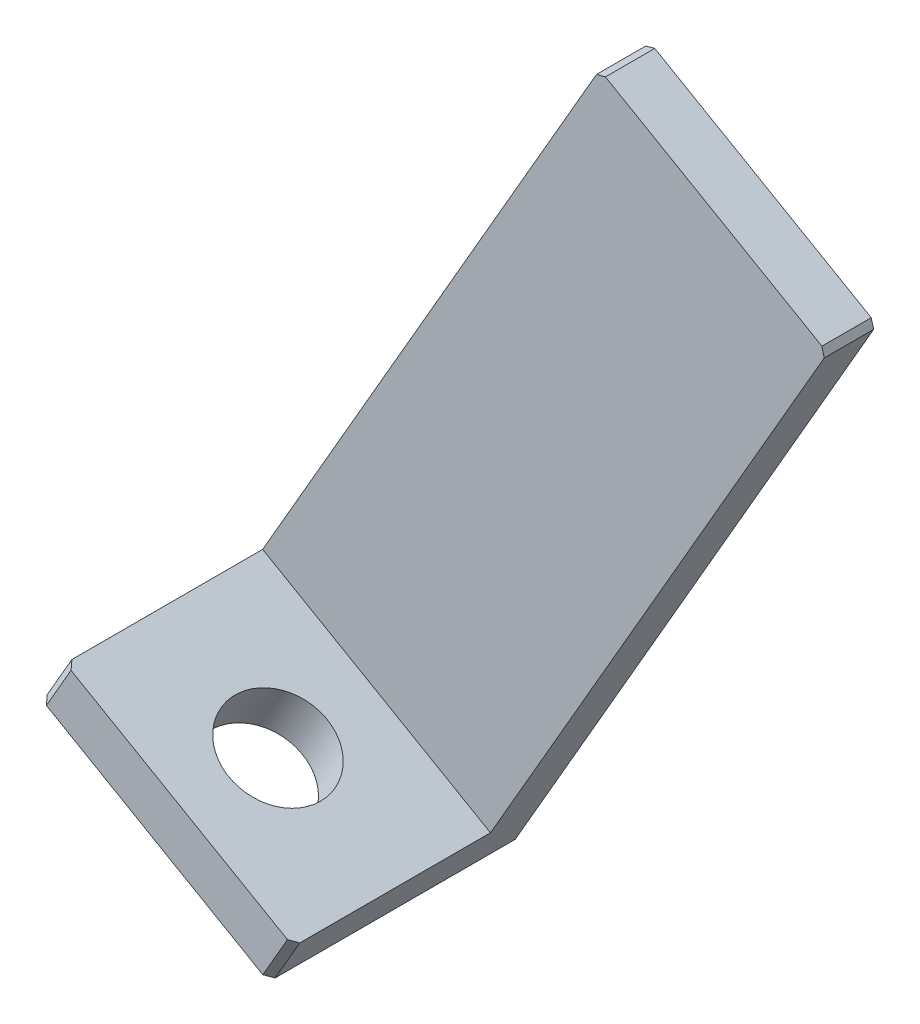
ISO-10303-21;
HEADER;
FILE_DESCRIPTION(('STEP AP214'),'2;1');
FILE_NAME('part.step','',(''),(''),'','','');
FILE_SCHEMA(('AUTOMOTIVE_DESIGN { 1 0 10303 214 1 1 1 1 }'));
ENDSEC;
DATA;
#1=APPLICATION_CONTEXT('core data for automotive mechanical design processes');
#2=APPLICATION_PROTOCOL_DEFINITION('international standard','automotive_design',2000,#1);
#3=PRODUCT_CONTEXT('',#1,'mechanical');
#4=PRODUCT('Part','Part','',(#3));
#5=PRODUCT_RELATED_PRODUCT_CATEGORY('part','',(#4));
#6=PRODUCT_DEFINITION_FORMATION('','',#4);
#7=PRODUCT_DEFINITION_CONTEXT('part definition',#1,'design');
#8=PRODUCT_DEFINITION('design','',#6,#7);
#9=PRODUCT_DEFINITION_SHAPE('','',#8);
#10=(LENGTH_UNIT() NAMED_UNIT(*) SI_UNIT(.MILLI.,.METRE.));
#11=(NAMED_UNIT(*) PLANE_ANGLE_UNIT() SI_UNIT($,.RADIAN.));
#12=(NAMED_UNIT(*) SI_UNIT($,.STERADIAN.) SOLID_ANGLE_UNIT());
#13=UNCERTAINTY_MEASURE_WITH_UNIT(LENGTH_MEASURE(1.E-05),#10,'distance_accuracy_value','');
#14=(GEOMETRIC_REPRESENTATION_CONTEXT(3) GLOBAL_UNCERTAINTY_ASSIGNED_CONTEXT((#13)) GLOBAL_UNIT_ASSIGNED_CONTEXT((#10,
#11,#12)) REPRESENTATION_CONTEXT('',''));
#15=CARTESIAN_POINT('',(0.,0.,0.));
#16=DIRECTION('',(0.,0.,1.));
#17=DIRECTION('',(1.,0.,0.));
#18=AXIS2_PLACEMENT_3D('',#15,#16,#17);
#19=CARTESIAN_POINT('',(-83.2560606555177,530.928285192831,-366.457743681072));
#20=DIRECTION('',(-0.612372435695707,0.353553390593224,0.707106781186648));
#21=DIRECTION('',(0.755928946018547,0.,0.654653670707871));
#22=AXIS2_PLACEMENT_3D('',#19,#20,#21);
#23=PLANE('',#22);
#24=DIRECTION('',(0.612372435696017,-0.353553390593118,0.707106781186433));
#25=VECTOR('',#24,1.);
#26=CARTESIAN_POINT('',(-83.7176631958962,530.328766139993,-366.557743681072));
#27=LINE('',#26,#25);
#28=CARTESIAN_POINT('',(-83.7176631958961,530.328766139993,-366.557743681072));
#29=VERTEX_POINT('',#28);
#30=CARTESIAN_POINT('',(-83.5444581151392,530.228766139993,-366.357743681072));
#31=VERTEX_POINT('',#30);
#32=EDGE_CURVE('E106',#29,#31,#27,.T.);
#33=ORIENTED_EDGE('',*,*,#32,.T.);
#34=DIRECTION('',(0.499999999999902,0.866025403784495,0.));
#35=VECTOR('',#34,1.);
#36=CARTESIAN_POINT('',(-83.5444581151392,530.228766139993,-366.357743681072));
#37=LINE('',#36,#35);
#38=CARTESIAN_POINT('',(-82.7944581151391,531.52780424567,-366.357743681072));
#39=VERTEX_POINT('',#38);
#40=EDGE_CURVE('E103',#31,#39,#37,.T.);
#41=ORIENTED_EDGE('',*,*,#40,.T.);
#42=DIRECTION('',(0.612372435695711,-0.353553390593224,0.707106781186645));
#43=VECTOR('',#42,1.);
#44=CARTESIAN_POINT('',(-82.9676631958961,531.62780424567,-366.557743681072));
#45=LINE('',#44,#43);
#46=CARTESIAN_POINT('',(-82.9676631958961,531.62780424567,-366.557743681072));
#47=VERTEX_POINT('',#46);
#48=EDGE_CURVE('E95',#47,#39,#45,.T.);
#49=ORIENTED_EDGE('',*,*,#48,.F.);
#50=DIRECTION('',(0.500000000000001,0.866025403784438,0.));
#51=VECTOR('',#50,1.);
#52=CARTESIAN_POINT('',(-83.3426631958962,530.978285192831,-366.557743681072));
#53=LINE('',#52,#51);
#54=EDGE_CURVE('E141',#47,#29,#53,.F.);
#55=ORIENTED_EDGE('',*,*,#54,.T.);
#56=EDGE_LOOP('',(#33,#41,#49,#55));
#57=FACE_BOUND('',#56,.T.);
#58=ADVANCED_FACE('F17',(#57),#23,.T.);
#59=CARTESIAN_POINT('',(-79.8785615807584,528.978285192831,-366.357743681072));
#60=DIRECTION('',(0.,0.,-1.));
#61=DIRECTION('',(-1.,0.,0.));
#62=AXIS2_PLACEMENT_3D('',#59,#60,#61);
#63=PLANE('',#62);
#64=DIRECTION('',(-0.866025403784438,0.500000000000001,0.));
#65=VECTOR('',#64,1.);
#66=CARTESIAN_POINT('',(-79.5035615807584,529.62780424567,-366.357743681072));
#67=LINE('',#66,#65);
#68=CARTESIAN_POINT('',(-76.2126650463776,527.72780424567,-366.357743681072));
#69=VERTEX_POINT('',#68);
#70=EDGE_CURVE('E92',#39,#69,#67,.F.);
#71=ORIENTED_EDGE('',*,*,#70,.F.);
#72=ORIENTED_EDGE('',*,*,#40,.F.);
#73=DIRECTION('',(-0.866025403784438,0.500000000000001,0.));
#74=VECTOR('',#73,1.);
#75=CARTESIAN_POINT('',(-80.2535615807584,528.328766139993,-366.357743681072));
#76=LINE('',#75,#74);
#77=CARTESIAN_POINT('',(-76.9626650463776,526.428766139993,-366.357743681072));
#78=VERTEX_POINT('',#77);
#79=EDGE_CURVE('E129',#31,#78,#76,.F.);
#80=ORIENTED_EDGE('',*,*,#79,.T.);
#81=DIRECTION('',(-0.499999999999962,-0.866025403784461,0.));
#82=VECTOR('',#81,1.);
#83=CARTESIAN_POINT('',(-76.2126650463775,527.72780424567,-366.357743681072));
#84=LINE('',#83,#82);
#85=EDGE_CURVE('E113',#69,#78,#84,.T.);
#86=ORIENTED_EDGE('',*,*,#85,.F.);
#87=EDGE_LOOP('',(#71,#72,#80,#86));
#88=FACE_BOUND('',#87,.T.);
#89=ADVANCED_FACE('F112',(#88),#63,.F.);
#90=CARTESIAN_POINT('',(-79.0035615807584,530.493829649454,-369.357743681072));
#91=DIRECTION('',(-0.5,-0.866025403784438,0.));
#92=DIRECTION('',(0.866025403784438,-0.5,0.));
#93=AXIS2_PLACEMENT_3D('',#90,#91,#92);
#94=CYLINDRICAL_SURFACE('',#93,1.5);
#95=CARTESIAN_POINT('',(-79.5035615807583,529.62780424567,-369.357743681072));
#96=DIRECTION('',(-0.5,-0.866025403784438,0.));
#97=DIRECTION('',(0.866025403784438,-0.5,0.));
#98=AXIS2_PLACEMENT_3D('',#95,#96,#97);
#99=CIRCLE('',#98,1.5);
#100=CARTESIAN_POINT('',(-78.2045234750816,528.87780424567,-369.357743681072));
#101=VERTEX_POINT('',#100);
#102=EDGE_CURVE('E20',#101,#101,#99,.T.);
#103=ORIENTED_EDGE('',*,*,#102,.F.);
#104=EDGE_LOOP('',(#103));
#105=FACE_BOUND('',#104,.T.);
#106=CARTESIAN_POINT('',(-80.2535615807583,528.328766139993,-369.357743681072));
#107=DIRECTION('',(-0.5,-0.866025403784438,0.));
#108=DIRECTION('',(0.866025403784438,-0.5,0.));
#109=AXIS2_PLACEMENT_3D('',#106,#107,#108);
#110=CIRCLE('',#109,1.5);
#111=CARTESIAN_POINT('',(-78.9545234750817,527.578766139993,-369.357743681072));
#112=VERTEX_POINT('',#111);
#113=EDGE_CURVE('E120',#112,#112,#110,.T.);
#114=ORIENTED_EDGE('',*,*,#113,.T.);
#115=EDGE_LOOP('',(#114));
#116=FACE_BOUND('',#115,.T.);
#117=ADVANCED_FACE('F293',(#105,#116),#94,.F.);
#118=CARTESIAN_POINT('',(-79.5035615807584,529.62780424567,-367.357743681072));
#119=DIRECTION('',(0.500000000000001,0.866025403784438,0.));
#120=DIRECTION('',(-0.866025403784438,0.500000000000001,0.));
#121=AXIS2_PLACEMENT_3D('',#118,#119,#120);
#122=PLANE('',#121);
#123=ORIENTED_EDGE('',*,*,#102,.T.);
#124=EDGE_LOOP('',(#123));
#125=FACE_BOUND('',#124,.T.);
#126=ORIENTED_EDGE('',*,*,#48,.T.);
#127=ORIENTED_EDGE('',*,*,#70,.T.);
#128=DIRECTION('',(-0.61237243569584,0.353553390593493,0.707106781186398));
#129=VECTOR('',#128,1.);
#130=CARTESIAN_POINT('',(-76.0394599656205,527.62780424567,-366.557743681072));
#131=LINE('',#130,#129);
#132=CARTESIAN_POINT('',(-76.0394599656205,527.62780424567,-366.557743681072));
#133=VERTEX_POINT('',#132);
#134=EDGE_CURVE('E116',#133,#69,#131,.T.);
#135=ORIENTED_EDGE('',*,*,#134,.F.);
#136=DIRECTION('',(0.,0.,1.));
#137=VECTOR('',#136,1.);
#138=CARTESIAN_POINT('',(-76.0394599656203,527.62780424567,-367.357743681072));
#139=LINE('',#138,#137);
#140=CARTESIAN_POINT('',(-76.0394599656205,527.62780424567,-372.357743681072));
#141=VERTEX_POINT('',#140);
#142=EDGE_CURVE('E122',#133,#141,#139,.F.);
#143=ORIENTED_EDGE('',*,*,#142,.T.);
#144=DIRECTION('',(-0.866025403784438,0.500000000000001,0.));
#145=VECTOR('',#144,1.);
#146=CARTESIAN_POINT('',(-76.0394599656206,527.62780424567,-372.357743681072));
#147=LINE('',#146,#145);
#148=CARTESIAN_POINT('',(-82.9676631958961,531.62780424567,-372.357743681072));
#149=VERTEX_POINT('',#148);
#150=EDGE_CURVE('E157',#141,#149,#147,.T.);
#151=ORIENTED_EDGE('',*,*,#150,.T.);
#152=DIRECTION('',(0.,0.,1.));
#153=VECTOR('',#152,1.);
#154=CARTESIAN_POINT('',(-82.9676631958959,531.62780424567,-367.357743681072));
#155=LINE('',#154,#153);
#156=EDGE_CURVE('E99',#149,#47,#155,.T.);
#157=ORIENTED_EDGE('',*,*,#156,.T.);
#158=EDGE_LOOP('',(#126,#127,#135,#143,#151,#157));
#159=FACE_BOUND('',#158,.T.);
#160=ADVANCED_FACE('F97',(#125,#159),#122,.T.);
#161=CARTESIAN_POINT('',(-76.5010625059991,527.028285192831,-366.457743681072));
#162=DIRECTION('',(0.612372435695707,-0.353553390593224,0.707106781186648));
#163=DIRECTION('',(0.755928946018547,0.,-0.654653670707871));
#164=AXIS2_PLACEMENT_3D('',#161,#162,#163);
#165=PLANE('',#164);
#166=ORIENTED_EDGE('',*,*,#134,.T.);
#167=ORIENTED_EDGE('',*,*,#85,.T.);
#168=DIRECTION('',(0.612372435695864,-0.353553390593171,-0.707106781186539));
#169=VECTOR('',#168,1.);
#170=CARTESIAN_POINT('',(-76.9626650463776,526.428766139993,-366.357743681072));
#171=LINE('',#170,#169);
#172=CARTESIAN_POINT('',(-76.7894599656206,526.328766139993,-366.557743681072));
#173=VERTEX_POINT('',#172);
#174=EDGE_CURVE('E123',#78,#173,#171,.T.);
#175=ORIENTED_EDGE('',*,*,#174,.T.);
#176=DIRECTION('',(-0.500000000000001,-0.866025403784438,0.));
#177=VECTOR('',#176,1.);
#178=CARTESIAN_POINT('',(-76.4144599656206,526.978285192831,-366.557743681072));
#179=LINE('',#178,#177);
#180=EDGE_CURVE('E160',#173,#133,#179,.F.);
#181=ORIENTED_EDGE('',*,*,#180,.T.);
#182=EDGE_LOOP('',(#166,#167,#175,#181));
#183=FACE_BOUND('',#182,.T.);
#184=ADVANCED_FACE('F159',(#183),#165,.T.);
#185=CARTESIAN_POINT('',(-72.6810606555177,549.244722482872,-370.232743681072));
#186=DIRECTION('',(-0.258819045102383,0.965925826289105,0.));
#187=DIRECTION('',(-0.965925826289105,-0.258819045102383,0.));
#188=AXIS2_PLACEMENT_3D('',#185,#186,#187);
#189=PLANE('',#188);
#190=DIRECTION('',(-0.965925826289105,-0.258819045102383,0.));
#191=VECTOR('',#190,1.);
#192=CARTESIAN_POINT('',(-72.6810606555177,549.244722482872,-373.857743681072));
#193=LINE('',#192,#191);
#194=CARTESIAN_POINT('',(-72.5444581151391,549.281325023251,-373.857743681072));
#195=VERTEX_POINT('',#194);
#196=CARTESIAN_POINT('',(-72.817663195896,549.208119942494,-373.857743681072));
#197=VERTEX_POINT('',#196);
#198=EDGE_CURVE('E35',#195,#197,#193,.T.);
#199=ORIENTED_EDGE('',*,*,#198,.T.);
#200=DIRECTION('',(0.,0.,1.));
#201=VECTOR('',#200,1.);
#202=CARTESIAN_POINT('',(-72.8176631958958,549.208119942494,-367.357743681072));
#203=LINE('',#202,#201);
#204=CARTESIAN_POINT('',(-72.817663195896,549.208119942494,-372.357743681072));
#205=VERTEX_POINT('',#204);
#206=EDGE_CURVE('E147',#197,#205,#203,.T.);
#207=ORIENTED_EDGE('',*,*,#206,.T.);
#208=DIRECTION('',(0.965925826289044,0.25881904510261,0.));
#209=VECTOR('',#208,1.);
#210=CARTESIAN_POINT('',(-72.8176631958961,549.208119942494,-372.357743681072));
#211=LINE('',#210,#209);
#212=CARTESIAN_POINT('',(-72.5444581151391,549.281325023251,-372.357743681072));
#213=VERTEX_POINT('',#212);
#214=EDGE_CURVE('E154',#205,#213,#211,.T.);
#215=ORIENTED_EDGE('',*,*,#214,.T.);
#216=DIRECTION('',(0.,0.,1.));
#217=VECTOR('',#216,1.);
#218=CARTESIAN_POINT('',(-72.5444581151392,549.281325023251,-373.107743681072));
#219=LINE('',#218,#217);
#220=EDGE_CURVE('E177',#195,#213,#219,.T.);
#221=ORIENTED_EDGE('',*,*,#220,.F.);
#222=EDGE_LOOP('',(#199,#207,#215,#221));
#223=FACE_BOUND('',#222,.T.);
#224=ADVANCED_FACE('F200',(#223),#189,.T.);
#225=CARTESIAN_POINT('',(-74.7535615807584,537.855045581622,-372.357743681072));
#226=DIRECTION('',(0.,0.,-1.));
#227=DIRECTION('',(-1.,0.,0.));
#228=AXIS2_PLACEMENT_3D('',#225,#226,#227);
#229=PLANE('',#228);
#230=DIRECTION('',(0.500000000000001,0.866025403784438,0.));
#231=VECTOR('',#230,1.);
#232=CARTESIAN_POINT('',(-83.3426631958962,530.978285192831,-372.357743681072));
#233=LINE('',#232,#231);
#234=EDGE_CURVE('E144',#205,#149,#233,.F.);
#235=ORIENTED_EDGE('',*,*,#234,.T.);
#236=ORIENTED_EDGE('',*,*,#150,.F.);
#237=DIRECTION('',(-0.500000000000001,-0.866025403784438,0.));
#238=VECTOR('',#237,1.);
#239=CARTESIAN_POINT('',(-76.4144599656206,526.978285192831,-372.357743681072));
#240=LINE('',#239,#238);
#241=CARTESIAN_POINT('',(-65.8894599656206,545.208119942494,-372.357743681072));
#242=VERTEX_POINT('',#241);
#243=EDGE_CURVE('E127',#141,#242,#240,.F.);
#244=ORIENTED_EDGE('',*,*,#243,.T.);
#245=DIRECTION('',(-0.258819045102658,0.965925826289032,0.));
#246=VECTOR('',#245,1.);
#247=CARTESIAN_POINT('',(-65.9260625059991,545.344722482872,-372.357743681072));
#248=LINE('',#247,#246);
#249=CARTESIAN_POINT('',(-65.9626650463776,545.481325023251,-372.357743681072));
#250=VERTEX_POINT('',#249);
#251=EDGE_CURVE('E150',#250,#242,#248,.F.);
#252=ORIENTED_EDGE('',*,*,#251,.F.);
#253=DIRECTION('',(-0.866025403784438,0.500000000000001,0.));
#254=VECTOR('',#253,1.);
#255=CARTESIAN_POINT('',(-69.2535615807584,547.381325023251,-372.357743681072));
#256=LINE('',#255,#254);
#257=EDGE_CURVE('E179',#213,#250,#256,.F.);
#258=ORIENTED_EDGE('',*,*,#257,.F.);
#259=ORIENTED_EDGE('',*,*,#214,.F.);
#260=EDGE_LOOP('',(#235,#236,#244,#252,#258,#259));
#261=FACE_BOUND('',#260,.T.);
#262=ADVANCED_FACE('F207',(#261),#229,.F.);
#263=CARTESIAN_POINT('',(-65.9260625059991,545.344722482872,-370.232743681072));
#264=DIRECTION('',(0.965925826289032,0.258819045102658,0.));
#265=DIRECTION('',(-0.258819045102658,0.965925826289032,0.));
#266=AXIS2_PLACEMENT_3D('',#263,#264,#265);
#267=PLANE('',#266);
#268=ORIENTED_EDGE('',*,*,#251,.T.);
#269=DIRECTION('',(0.,0.,1.));
#270=VECTOR('',#269,1.);
#271=CARTESIAN_POINT('',(-65.8894599656203,545.208119942494,-367.357743681072));
#272=LINE('',#271,#270);
#273=CARTESIAN_POINT('',(-65.8894599656206,545.208119942494,-373.857743681072));
#274=VERTEX_POINT('',#273);
#275=EDGE_CURVE('E169',#242,#274,#272,.F.);
#276=ORIENTED_EDGE('',*,*,#275,.T.);
#277=DIRECTION('',(-0.258819045102658,0.965925826289032,0.));
#278=VECTOR('',#277,1.);
#279=CARTESIAN_POINT('',(-65.9260625059991,545.344722482872,-373.857743681072));
#280=LINE('',#279,#278);
#281=CARTESIAN_POINT('',(-65.9626650463776,545.481325023251,-373.857743681072));
#282=VERTEX_POINT('',#281);
#283=EDGE_CURVE('E152',#274,#282,#280,.T.);
#284=ORIENTED_EDGE('',*,*,#283,.T.);
#285=DIRECTION('',(0.,0.,1.));
#286=VECTOR('',#285,1.);
#287=CARTESIAN_POINT('',(-65.9626650463776,545.481325023251,-373.107743681072));
#288=LINE('',#287,#286);
#289=EDGE_CURVE('E181',#250,#282,#288,.F.);
#290=ORIENTED_EDGE('',*,*,#289,.F.);
#291=EDGE_LOOP('',(#268,#276,#284,#290));
#292=FACE_BOUND('',#291,.T.);
#293=ADVANCED_FACE('F206',(#292),#267,.T.);
#294=CARTESIAN_POINT('',(-83.3426631958962,530.978285192831,-367.357743681072));
#295=DIRECTION('',(0.866025403784438,-0.500000000000001,0.));
#296=DIRECTION('',(0.500000000000001,0.866025403784438,0.));
#297=AXIS2_PLACEMENT_3D('',#294,#295,#296);
#298=PLANE('',#297);
#299=ORIENTED_EDGE('',*,*,#156,.F.);
#300=ORIENTED_EDGE('',*,*,#234,.F.);
#301=ORIENTED_EDGE('',*,*,#206,.F.);
#302=DIRECTION('',(-0.499999999999997,-0.86602540378444,0.));
#303=VECTOR('',#302,1.);
#304=CARTESIAN_POINT('',(-72.8176631958961,549.208119942494,-373.857743681072));
#305=LINE('',#304,#303);
#306=CARTESIAN_POINT('',(-83.7176631958961,530.328766139993,-373.857743681072));
#307=VERTEX_POINT('',#306);
#308=EDGE_CURVE('E184',#197,#307,#305,.T.);
#309=ORIENTED_EDGE('',*,*,#308,.T.);
#310=DIRECTION('',(0.,0.,1.));
#311=VECTOR('',#310,1.);
#312=CARTESIAN_POINT('',(-83.7176631958962,530.328766139993,-367.357743681072));
#313=LINE('',#312,#311);
#314=EDGE_CURVE('E135',#307,#29,#313,.T.);
#315=ORIENTED_EDGE('',*,*,#314,.T.);
#316=ORIENTED_EDGE('',*,*,#54,.F.);
#317=EDGE_LOOP('',(#299,#300,#301,#309,#315,#316));
#318=FACE_BOUND('',#317,.T.);
#319=ADVANCED_FACE('F196',(#318),#298,.F.);
#320=CARTESIAN_POINT('',(-80.2535615807584,528.328766139993,-367.357743681072));
#321=DIRECTION('',(0.500000000000001,0.866025403784438,0.));
#322=DIRECTION('',(-0.866025403784438,0.500000000000001,0.));
#323=AXIS2_PLACEMENT_3D('',#320,#321,#322);
#324=PLANE('',#323);
#325=ORIENTED_EDGE('',*,*,#113,.F.);
#326=EDGE_LOOP('',(#325));
#327=FACE_BOUND('',#326,.T.);
#328=ORIENTED_EDGE('',*,*,#79,.F.);
#329=ORIENTED_EDGE('',*,*,#32,.F.);
#330=ORIENTED_EDGE('',*,*,#314,.F.);
#331=DIRECTION('',(0.866025403784441,-0.499999999999996,0.));
#332=VECTOR('',#331,1.);
#333=CARTESIAN_POINT('',(-83.7176631958962,530.328766139993,-373.857743681072));
#334=LINE('',#333,#332);
#335=CARTESIAN_POINT('',(-76.7894599656206,526.328766139993,-373.857743681072));
#336=VERTEX_POINT('',#335);
#337=EDGE_CURVE('E187',#307,#336,#334,.T.);
#338=ORIENTED_EDGE('',*,*,#337,.T.);
#339=DIRECTION('',(0.,0.,1.));
#340=VECTOR('',#339,1.);
#341=CARTESIAN_POINT('',(-76.7894599656204,526.328766139993,-367.357743681072));
#342=LINE('',#341,#340);
#343=EDGE_CURVE('E172',#336,#173,#342,.T.);
#344=ORIENTED_EDGE('',*,*,#343,.T.);
#345=ORIENTED_EDGE('',*,*,#174,.F.);
#346=EDGE_LOOP('',(#328,#329,#330,#338,#344,#345));
#347=FACE_BOUND('',#346,.T.);
#348=ADVANCED_FACE('F194',(#327,#347),#324,.F.);
#349=CARTESIAN_POINT('',(-76.4144599656206,526.978285192831,-367.357743681072));
#350=DIRECTION('',(-0.866025403784438,0.500000000000001,0.));
#351=DIRECTION('',(-0.500000000000001,-0.866025403784438,0.));
#352=AXIS2_PLACEMENT_3D('',#349,#350,#351);
#353=PLANE('',#352);
#354=ORIENTED_EDGE('',*,*,#343,.F.);
#355=DIRECTION('',(0.499999999999994,0.866025403784442,0.));
#356=VECTOR('',#355,1.);
#357=CARTESIAN_POINT('',(-76.7894599656206,526.328766139993,-373.857743681072));
#358=LINE('',#357,#356);
#359=EDGE_CURVE('E26',#336,#274,#358,.T.);
#360=ORIENTED_EDGE('',*,*,#359,.T.);
#361=ORIENTED_EDGE('',*,*,#275,.F.);
#362=ORIENTED_EDGE('',*,*,#243,.F.);
#363=ORIENTED_EDGE('',*,*,#142,.F.);
#364=ORIENTED_EDGE('',*,*,#180,.F.);
#365=EDGE_LOOP('',(#354,#360,#361,#362,#363,#364));
#366=FACE_BOUND('',#365,.T.);
#367=ADVANCED_FACE('F163',(#366),#353,.F.);
#368=CARTESIAN_POINT('',(-69.2535615807584,547.381325023251,-373.107743681072));
#369=DIRECTION('',(0.500000000000001,0.866025403784438,0.));
#370=DIRECTION('',(-0.866025403784438,0.500000000000001,0.));
#371=AXIS2_PLACEMENT_3D('',#368,#369,#370);
#372=PLANE('',#371);
#373=ORIENTED_EDGE('',*,*,#289,.T.);
#374=DIRECTION('',(-0.866025403784433,0.50000000000001,0.));
#375=VECTOR('',#374,1.);
#376=CARTESIAN_POINT('',(-65.9626650463776,545.481325023251,-373.857743681072));
#377=LINE('',#376,#375);
#378=EDGE_CURVE('E11',#282,#195,#377,.T.);
#379=ORIENTED_EDGE('',*,*,#378,.T.);
#380=ORIENTED_EDGE('',*,*,#220,.T.);
#381=ORIENTED_EDGE('',*,*,#257,.T.);
#382=EDGE_LOOP('',(#373,#379,#380,#381));
#383=FACE_BOUND('',#382,.T.);
#384=ADVANCED_FACE('F203',(#383),#372,.T.);
#385=CARTESIAN_POINT('',(-74.7535615807584,537.855045581622,-373.857743681072));
#386=DIRECTION('',(0.,0.,1.));
#387=DIRECTION('',(1.,0.,0.));
#388=AXIS2_PLACEMENT_3D('',#385,#386,#387);
#389=PLANE('',#388);
#390=ORIENTED_EDGE('',*,*,#378,.F.);
#391=ORIENTED_EDGE('',*,*,#283,.F.);
#392=ORIENTED_EDGE('',*,*,#359,.F.);
#393=ORIENTED_EDGE('',*,*,#337,.F.);
#394=ORIENTED_EDGE('',*,*,#308,.F.);
#395=ORIENTED_EDGE('',*,*,#198,.F.);
#396=EDGE_LOOP('',(#390,#391,#392,#393,#394,#395));
#397=FACE_BOUND('',#396,.T.);
#398=ADVANCED_FACE('F192',(#397),#389,.F.);
#399=CLOSED_SHELL('',(#58,#89,#117,#160,#184,#224,#262,#293,#319,#348,#367,#384,#398));
#400=MANIFOLD_SOLID_BREP('B1',#399);
#401=ADVANCED_BREP_SHAPE_REPRESENTATION('',(#18,#400),#14);
#402=SHAPE_DEFINITION_REPRESENTATION(#9,#401);
ENDSEC;
END-ISO-10303-21;
